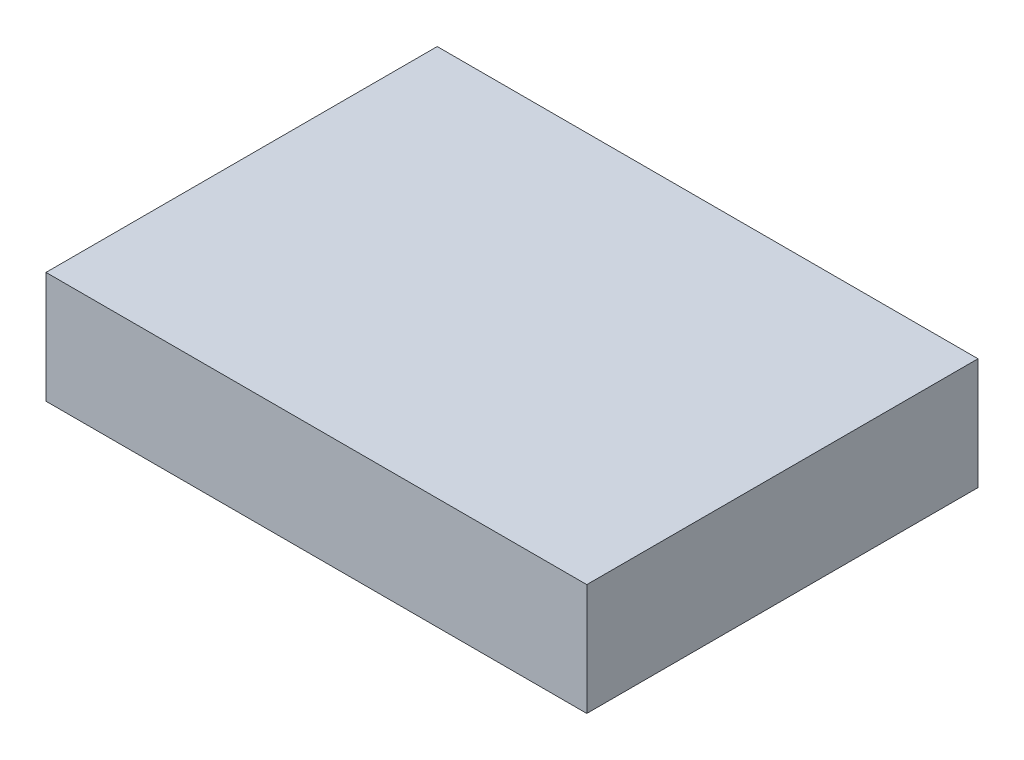
ISO-10303-21;
HEADER;
FILE_DESCRIPTION(('STEP AP214'),'2;1');
FILE_NAME('part.step','',(''),(''),'','','');
FILE_SCHEMA(('AUTOMOTIVE_DESIGN { 1 0 10303 214 1 1 1 1 }'));
ENDSEC;
DATA;
#1=APPLICATION_CONTEXT('core data for automotive mechanical design processes');
#2=APPLICATION_PROTOCOL_DEFINITION('international standard','automotive_design',2000,#1);
#3=PRODUCT_CONTEXT('',#1,'mechanical');
#4=PRODUCT('Part','Part','',(#3));
#5=PRODUCT_RELATED_PRODUCT_CATEGORY('part','',(#4));
#6=PRODUCT_DEFINITION_FORMATION('','',#4);
#7=PRODUCT_DEFINITION_CONTEXT('part definition',#1,'design');
#8=PRODUCT_DEFINITION('design','',#6,#7);
#9=PRODUCT_DEFINITION_SHAPE('','',#8);
#10=(LENGTH_UNIT() NAMED_UNIT(*) SI_UNIT(.MILLI.,.METRE.));
#11=(NAMED_UNIT(*) PLANE_ANGLE_UNIT() SI_UNIT($,.RADIAN.));
#12=(NAMED_UNIT(*) SI_UNIT($,.STERADIAN.) SOLID_ANGLE_UNIT());
#13=UNCERTAINTY_MEASURE_WITH_UNIT(LENGTH_MEASURE(1.E-05),#10,'distance_accuracy_value','');
#14=(GEOMETRIC_REPRESENTATION_CONTEXT(3) GLOBAL_UNCERTAINTY_ASSIGNED_CONTEXT((#13)) GLOBAL_UNIT_ASSIGNED_CONTEXT((#10,
#11,#12)) REPRESENTATION_CONTEXT('',''));
#15=CARTESIAN_POINT('',(0.,0.,0.));
#16=DIRECTION('',(0.,0.,1.));
#17=DIRECTION('',(1.,0.,0.));
#18=AXIS2_PLACEMENT_3D('',#15,#16,#17);
#19=CARTESIAN_POINT('',(-31.1882554112285,10.,-19.5893174483749));
#20=DIRECTION('',(1.,0.,0.));
#21=DIRECTION('',(0.,0.,-1.));
#22=AXIS2_PLACEMENT_3D('',#19,#20,#21);
#23=PLANE('',#22);
#24=DIRECTION('',(0.,0.,1.));
#25=VECTOR('',#24,1.);
#26=CARTESIAN_POINT('',(-31.1882554112285,0.,-19.5893174483749));
#27=LINE('',#26,#25);
#28=CARTESIAN_POINT('',(-31.1882554112285,0.,-19.5893174483749));
#29=VERTEX_POINT('',#28);
#30=CARTESIAN_POINT('',(-31.1882554112285,0.,15.4652506171381));
#31=VERTEX_POINT('',#30);
#32=EDGE_CURVE('E112',#29,#31,#27,.T.);
#33=ORIENTED_EDGE('',*,*,#32,.T.);
#34=DIRECTION('',(0.,-1.,0.));
#35=VECTOR('',#34,1.);
#36=CARTESIAN_POINT('',(-31.1882554112285,10.,15.4652506171381));
#37=LINE('',#36,#35);
#38=CARTESIAN_POINT('',(-31.1882554112285,10.,15.4652506171381));
#39=VERTEX_POINT('',#38);
#40=EDGE_CURVE('E11',#39,#31,#37,.T.);
#41=ORIENTED_EDGE('',*,*,#40,.F.);
#42=DIRECTION('',(0.,0.,1.));
#43=VECTOR('',#42,1.);
#44=CARTESIAN_POINT('',(-31.1882554112285,10.,-19.5893174483749));
#45=LINE('',#44,#43);
#46=CARTESIAN_POINT('',(-31.1882554112285,10.,-19.5893174483749));
#47=VERTEX_POINT('',#46);
#48=EDGE_CURVE('E95',#47,#39,#45,.T.);
#49=ORIENTED_EDGE('',*,*,#48,.F.);
#50=DIRECTION('',(0.,-1.,0.));
#51=VECTOR('',#50,1.);
#52=CARTESIAN_POINT('',(-31.1882554112285,10.,-19.5893174483749));
#53=LINE('',#52,#51);
#54=EDGE_CURVE('E108',#47,#29,#53,.T.);
#55=ORIENTED_EDGE('',*,*,#54,.T.);
#56=EDGE_LOOP('',(#33,#41,#49,#55));
#57=FACE_BOUND('',#56,.T.);
#58=ADVANCED_FACE('F43',(#57),#23,.F.);
#59=CARTESIAN_POINT('',(-31.1882554112285,10.,15.4652506171381));
#60=DIRECTION('',(0.,0.,-1.));
#61=DIRECTION('',(-1.,0.,0.));
#62=AXIS2_PLACEMENT_3D('',#59,#60,#61);
#63=PLANE('',#62);
#64=DIRECTION('',(1.,0.,0.));
#65=VECTOR('',#64,1.);
#66=CARTESIAN_POINT('',(-31.1882554112285,0.,15.4652506171381));
#67=LINE('',#66,#65);
#68=CARTESIAN_POINT('',(17.2695298558042,0.,15.4652506171381));
#69=VERTEX_POINT('',#68);
#70=EDGE_CURVE('E100',#31,#69,#67,.T.);
#71=ORIENTED_EDGE('',*,*,#70,.T.);
#72=DIRECTION('',(0.,-1.,0.));
#73=VECTOR('',#72,1.);
#74=CARTESIAN_POINT('',(17.2695298558042,10.,15.4652506171381));
#75=LINE('',#74,#73);
#76=CARTESIAN_POINT('',(17.2695298558042,10.,15.4652506171381));
#77=VERTEX_POINT('',#76);
#78=EDGE_CURVE('E52',#77,#69,#75,.T.);
#79=ORIENTED_EDGE('',*,*,#78,.F.);
#80=DIRECTION('',(1.,0.,0.));
#81=VECTOR('',#80,1.);
#82=CARTESIAN_POINT('',(-31.1882554112285,10.,15.4652506171381));
#83=LINE('',#82,#81);
#84=EDGE_CURVE('E90',#39,#77,#83,.T.);
#85=ORIENTED_EDGE('',*,*,#84,.F.);
#86=ORIENTED_EDGE('',*,*,#40,.T.);
#87=EDGE_LOOP('',(#71,#79,#85,#86));
#88=FACE_BOUND('',#87,.T.);
#89=ADVANCED_FACE('F99',(#88),#63,.F.);
#90=CARTESIAN_POINT('',(17.2695298558042,10.,-19.5893174483749));
#91=DIRECTION('',(-1.,0.,0.));
#92=DIRECTION('',(0.,0.,1.));
#93=AXIS2_PLACEMENT_3D('',#90,#91,#92);
#94=PLANE('',#93);
#95=DIRECTION('',(0.,0.,-1.));
#96=VECTOR('',#95,1.);
#97=CARTESIAN_POINT('',(17.2695298558042,0.,-19.5893174483749));
#98=LINE('',#97,#96);
#99=CARTESIAN_POINT('',(17.2695298558042,0.,-19.5893174483749));
#100=VERTEX_POINT('',#99);
#101=EDGE_CURVE('E77',#69,#100,#98,.T.);
#102=ORIENTED_EDGE('',*,*,#101,.T.);
#103=DIRECTION('',(0.,-1.,0.));
#104=VECTOR('',#103,1.);
#105=CARTESIAN_POINT('',(17.2695298558042,10.,-19.5893174483749));
#106=LINE('',#105,#104);
#107=CARTESIAN_POINT('',(17.2695298558042,10.,-19.5893174483749));
#108=VERTEX_POINT('',#107);
#109=EDGE_CURVE('E102',#108,#100,#106,.T.);
#110=ORIENTED_EDGE('',*,*,#109,.F.);
#111=DIRECTION('',(0.,0.,-1.));
#112=VECTOR('',#111,1.);
#113=CARTESIAN_POINT('',(17.2695298558042,10.,-19.5893174483749));
#114=LINE('',#113,#112);
#115=EDGE_CURVE('E93',#77,#108,#114,.T.);
#116=ORIENTED_EDGE('',*,*,#115,.F.);
#117=ORIENTED_EDGE('',*,*,#78,.T.);
#118=EDGE_LOOP('',(#102,#110,#116,#117));
#119=FACE_BOUND('',#118,.T.);
#120=ADVANCED_FACE('F103',(#119),#94,.F.);
#121=CARTESIAN_POINT('',(-31.1882554112285,10.,-19.5893174483749));
#122=DIRECTION('',(0.,0.,1.));
#123=DIRECTION('',(1.,0.,0.));
#124=AXIS2_PLACEMENT_3D('',#121,#122,#123);
#125=PLANE('',#124);
#126=DIRECTION('',(-1.,0.,0.));
#127=VECTOR('',#126,1.);
#128=CARTESIAN_POINT('',(-31.1882554112285,0.,-19.5893174483749));
#129=LINE('',#128,#127);
#130=EDGE_CURVE('E83',#100,#29,#129,.T.);
#131=ORIENTED_EDGE('',*,*,#130,.T.);
#132=ORIENTED_EDGE('',*,*,#54,.F.);
#133=DIRECTION('',(-1.,0.,0.));
#134=VECTOR('',#133,1.);
#135=CARTESIAN_POINT('',(-31.1882554112285,10.,-19.5893174483749));
#136=LINE('',#135,#134);
#137=EDGE_CURVE('E60',#108,#47,#136,.T.);
#138=ORIENTED_EDGE('',*,*,#137,.F.);
#139=ORIENTED_EDGE('',*,*,#109,.T.);
#140=EDGE_LOOP('',(#131,#132,#138,#139));
#141=FACE_BOUND('',#140,.T.);
#142=ADVANCED_FACE('F126',(#141),#125,.F.);
#143=CARTESIAN_POINT('',(0.,10.,0.));
#144=DIRECTION('',(0.,1.,0.));
#145=DIRECTION('',(0.,0.,1.));
#146=AXIS2_PLACEMENT_3D('',#143,#144,#145);
#147=PLANE('',#146);
#148=ORIENTED_EDGE('',*,*,#48,.T.);
#149=ORIENTED_EDGE('',*,*,#84,.T.);
#150=ORIENTED_EDGE('',*,*,#115,.T.);
#151=ORIENTED_EDGE('',*,*,#137,.T.);
#152=EDGE_LOOP('',(#148,#149,#150,#151));
#153=FACE_BOUND('',#152,.T.);
#154=ADVANCED_FACE('F91',(#153),#147,.T.);
#155=CARTESIAN_POINT('',(0.,0.,0.));
#156=DIRECTION('',(0.,1.,0.));
#157=DIRECTION('',(0.,0.,1.));
#158=AXIS2_PLACEMENT_3D('',#155,#156,#157);
#159=PLANE('',#158);
#160=ORIENTED_EDGE('',*,*,#32,.F.);
#161=ORIENTED_EDGE('',*,*,#130,.F.);
#162=ORIENTED_EDGE('',*,*,#101,.F.);
#163=ORIENTED_EDGE('',*,*,#70,.F.);
#164=EDGE_LOOP('',(#160,#161,#162,#163));
#165=FACE_BOUND('',#164,.T.);
#166=ADVANCED_FACE('F129',(#165),#159,.F.);
#167=CLOSED_SHELL('',(#58,#89,#120,#142,#154,#166));
#168=MANIFOLD_SOLID_BREP('B2',#167);
#169=ADVANCED_BREP_SHAPE_REPRESENTATION('',(#18,#168),#14);
#170=SHAPE_DEFINITION_REPRESENTATION(#9,#169);
ENDSEC;
END-ISO-10303-21;
